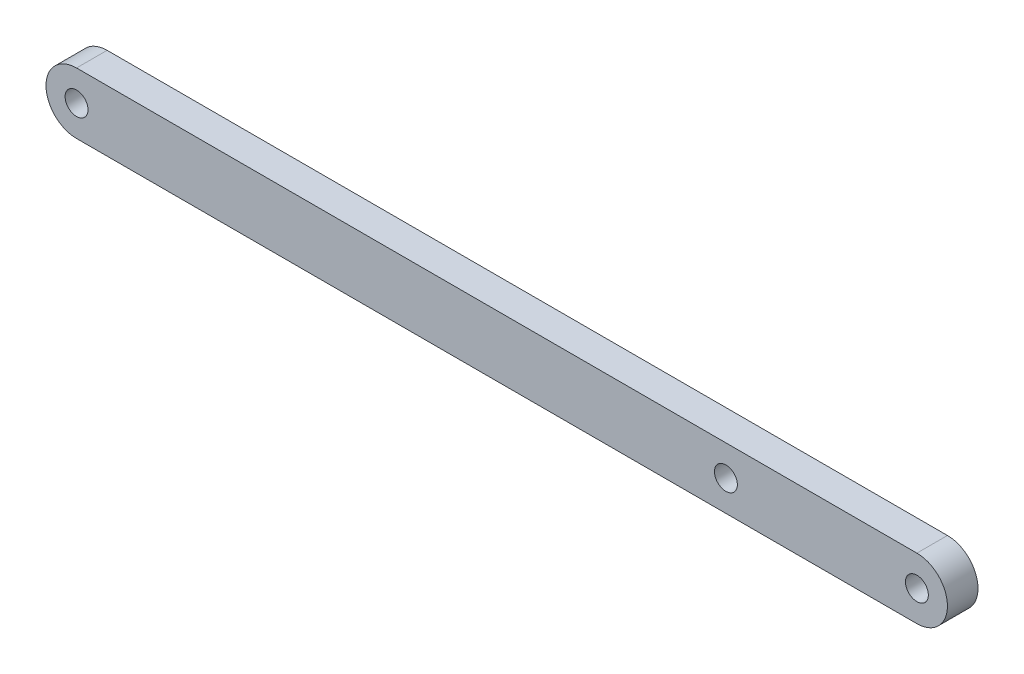
ISO-10303-21;
HEADER;
FILE_DESCRIPTION(('STEP AP214'),'2;1');
FILE_NAME('part.step','',(''),(''),'','','');
FILE_SCHEMA(('AUTOMOTIVE_DESIGN { 1 0 10303 214 1 1 1 1 }'));
ENDSEC;
DATA;
#1=APPLICATION_CONTEXT('core data for automotive mechanical design processes');
#2=APPLICATION_PROTOCOL_DEFINITION('international standard','automotive_design',2000,#1);
#3=PRODUCT_CONTEXT('',#1,'mechanical');
#4=PRODUCT('Part','Part','',(#3));
#5=PRODUCT_RELATED_PRODUCT_CATEGORY('part','',(#4));
#6=PRODUCT_DEFINITION_FORMATION('','',#4);
#7=PRODUCT_DEFINITION_CONTEXT('part definition',#1,'design');
#8=PRODUCT_DEFINITION('design','',#6,#7);
#9=PRODUCT_DEFINITION_SHAPE('','',#8);
#10=(LENGTH_UNIT() NAMED_UNIT(*) SI_UNIT(.MILLI.,.METRE.));
#11=(NAMED_UNIT(*) PLANE_ANGLE_UNIT() SI_UNIT($,.RADIAN.));
#12=(NAMED_UNIT(*) SI_UNIT($,.STERADIAN.) SOLID_ANGLE_UNIT());
#13=UNCERTAINTY_MEASURE_WITH_UNIT(LENGTH_MEASURE(1.E-05),#10,'distance_accuracy_value','');
#14=(GEOMETRIC_REPRESENTATION_CONTEXT(3) GLOBAL_UNCERTAINTY_ASSIGNED_CONTEXT((#13)) GLOBAL_UNIT_ASSIGNED_CONTEXT((#10,
#11,#12)) REPRESENTATION_CONTEXT('',''));
#15=CARTESIAN_POINT('',(0.,0.,0.));
#16=DIRECTION('',(0.,0.,1.));
#17=DIRECTION('',(1.,0.,0.));
#18=AXIS2_PLACEMENT_3D('',#15,#16,#17);
#19=CARTESIAN_POINT('',(55.,0.,4.));
#20=DIRECTION('',(0.,0.,1.));
#21=DIRECTION('',(1.,0.,0.));
#22=AXIS2_PLACEMENT_3D('',#19,#20,#21);
#23=PLANE('',#22);
#24=CARTESIAN_POINT('',(30.,0.,4.));
#25=DIRECTION('',(0.,0.,1.));
#26=DIRECTION('',(1.,0.,0.));
#27=AXIS2_PLACEMENT_3D('',#24,#25,#26);
#28=CIRCLE('',#27,1.5);
#29=CARTESIAN_POINT('',(31.5,0.,4.));
#30=VERTEX_POINT('',#29);
#31=EDGE_CURVE('E131',#30,#30,#28,.T.);
#32=ORIENTED_EDGE('',*,*,#31,.F.);
#33=EDGE_LOOP('',(#32));
#34=FACE_BOUND('',#33,.T.);
#35=CARTESIAN_POINT('',(-55.,0.,4.));
#36=DIRECTION('',(0.,0.,1.));
#37=DIRECTION('',(1.,0.,0.));
#38=AXIS2_PLACEMENT_3D('',#35,#36,#37);
#39=CIRCLE('',#38,1.5);
#40=CARTESIAN_POINT('',(-53.5,0.,4.));
#41=VERTEX_POINT('',#40);
#42=EDGE_CURVE('E108',#41,#41,#39,.T.);
#43=ORIENTED_EDGE('',*,*,#42,.F.);
#44=EDGE_LOOP('',(#43));
#45=FACE_BOUND('',#44,.T.);
#46=CARTESIAN_POINT('',(55.,0.,4.));
#47=DIRECTION('',(0.,0.,1.));
#48=DIRECTION('',(1.,0.,0.));
#49=AXIS2_PLACEMENT_3D('',#46,#47,#48);
#50=CIRCLE('',#49,4.);
#51=CARTESIAN_POINT('',(55.,-4.,4.));
#52=VERTEX_POINT('',#51);
#53=CARTESIAN_POINT('',(55.,4.,4.));
#54=VERTEX_POINT('',#53);
#55=EDGE_CURVE('E92',#52,#54,#50,.T.);
#56=ORIENTED_EDGE('',*,*,#55,.T.);
#57=DIRECTION('',(-1.,0.,0.));
#58=VECTOR('',#57,1.);
#59=CARTESIAN_POINT('',(55.,4.,4.));
#60=LINE('',#59,#58);
#61=CARTESIAN_POINT('',(-55.,3.99999999999999,4.));
#62=VERTEX_POINT('',#61);
#63=EDGE_CURVE('E87',#54,#62,#60,.T.);
#64=ORIENTED_EDGE('',*,*,#63,.T.);
#65=CARTESIAN_POINT('',(-55.,0.,4.));
#66=DIRECTION('',(0.,0.,1.));
#67=DIRECTION('',(1.,0.,0.));
#68=AXIS2_PLACEMENT_3D('',#65,#66,#67);
#69=CIRCLE('',#68,4.);
#70=CARTESIAN_POINT('',(-55.,-4.00000000000002,4.));
#71=VERTEX_POINT('',#70);
#72=EDGE_CURVE('E90',#62,#71,#69,.T.);
#73=ORIENTED_EDGE('',*,*,#72,.T.);
#74=DIRECTION('',(1.,0.,0.));
#75=VECTOR('',#74,1.);
#76=CARTESIAN_POINT('',(55.,-4.,4.));
#77=LINE('',#76,#75);
#78=EDGE_CURVE('E57',#71,#52,#77,.T.);
#79=ORIENTED_EDGE('',*,*,#78,.T.);
#80=EDGE_LOOP('',(#56,#64,#73,#79));
#81=FACE_BOUND('',#80,.T.);
#82=CARTESIAN_POINT('',(55.,0.,4.));
#83=DIRECTION('',(0.,0.,1.));
#84=DIRECTION('',(1.,0.,0.));
#85=AXIS2_PLACEMENT_3D('',#82,#83,#84);
#86=CIRCLE('',#85,1.5);
#87=CARTESIAN_POINT('',(56.5,0.,4.));
#88=VERTEX_POINT('',#87);
#89=EDGE_CURVE('E123',#88,#88,#86,.T.);
#90=ORIENTED_EDGE('',*,*,#89,.F.);
#91=EDGE_LOOP('',(#90));
#92=FACE_BOUND('',#91,.T.);
#93=ADVANCED_FACE('F39',(#34,#45,#81,#92),#23,.T.);
#94=CARTESIAN_POINT('',(55.,0.,0.));
#95=DIRECTION('',(0.,0.,1.));
#96=DIRECTION('',(1.,0.,0.));
#97=AXIS2_PLACEMENT_3D('',#94,#95,#96);
#98=PLANE('',#97);
#99=CARTESIAN_POINT('',(30.,0.,0.));
#100=DIRECTION('',(0.,0.,1.));
#101=DIRECTION('',(1.,0.,0.));
#102=AXIS2_PLACEMENT_3D('',#99,#100,#101);
#103=CIRCLE('',#102,1.5);
#104=CARTESIAN_POINT('',(31.5,0.,0.));
#105=VERTEX_POINT('',#104);
#106=EDGE_CURVE('E43',#105,#105,#103,.T.);
#107=ORIENTED_EDGE('',*,*,#106,.T.);
#108=EDGE_LOOP('',(#107));
#109=FACE_BOUND('',#108,.T.);
#110=CARTESIAN_POINT('',(55.,0.,0.));
#111=DIRECTION('',(0.,0.,1.));
#112=DIRECTION('',(1.,0.,0.));
#113=AXIS2_PLACEMENT_3D('',#110,#111,#112);
#114=CIRCLE('',#113,4.);
#115=CARTESIAN_POINT('',(55.,-4.,0.));
#116=VERTEX_POINT('',#115);
#117=CARTESIAN_POINT('',(55.,4.,0.));
#118=VERTEX_POINT('',#117);
#119=EDGE_CURVE('E105',#116,#118,#114,.T.);
#120=ORIENTED_EDGE('',*,*,#119,.F.);
#121=DIRECTION('',(1.,0.,0.));
#122=VECTOR('',#121,1.);
#123=CARTESIAN_POINT('',(55.,-4.,0.));
#124=LINE('',#123,#122);
#125=CARTESIAN_POINT('',(-55.,-4.00000000000002,0.));
#126=VERTEX_POINT('',#125);
#127=EDGE_CURVE('E80',#126,#116,#124,.T.);
#128=ORIENTED_EDGE('',*,*,#127,.F.);
#129=CARTESIAN_POINT('',(-55.,0.,0.));
#130=DIRECTION('',(0.,0.,1.));
#131=DIRECTION('',(1.,0.,0.));
#132=AXIS2_PLACEMENT_3D('',#129,#130,#131);
#133=CIRCLE('',#132,4.);
#134=CARTESIAN_POINT('',(-55.,3.99999999999999,0.));
#135=VERTEX_POINT('',#134);
#136=EDGE_CURVE('E74',#135,#126,#133,.T.);
#137=ORIENTED_EDGE('',*,*,#136,.F.);
#138=DIRECTION('',(-1.,0.,0.));
#139=VECTOR('',#138,1.);
#140=CARTESIAN_POINT('',(55.,4.,0.));
#141=LINE('',#140,#139);
#142=EDGE_CURVE('E96',#118,#135,#141,.T.);
#143=ORIENTED_EDGE('',*,*,#142,.F.);
#144=EDGE_LOOP('',(#120,#128,#137,#143));
#145=FACE_BOUND('',#144,.T.);
#146=CARTESIAN_POINT('',(-55.,0.,0.));
#147=DIRECTION('',(0.,0.,1.));
#148=DIRECTION('',(1.,0.,0.));
#149=AXIS2_PLACEMENT_3D('',#146,#147,#148);
#150=CIRCLE('',#149,1.5);
#151=CARTESIAN_POINT('',(-53.5,0.,0.));
#152=VERTEX_POINT('',#151);
#153=EDGE_CURVE('E120',#152,#152,#150,.T.);
#154=ORIENTED_EDGE('',*,*,#153,.T.);
#155=EDGE_LOOP('',(#154));
#156=FACE_BOUND('',#155,.T.);
#157=CARTESIAN_POINT('',(55.,0.,0.));
#158=DIRECTION('',(0.,0.,1.));
#159=DIRECTION('',(1.,0.,0.));
#160=AXIS2_PLACEMENT_3D('',#157,#158,#159);
#161=CIRCLE('',#160,1.5);
#162=CARTESIAN_POINT('',(56.5,0.,0.));
#163=VERTEX_POINT('',#162);
#164=EDGE_CURVE('E126',#163,#163,#161,.T.);
#165=ORIENTED_EDGE('',*,*,#164,.T.);
#166=EDGE_LOOP('',(#165));
#167=FACE_BOUND('',#166,.T.);
#168=ADVANCED_FACE('F116',(#109,#145,#156,#167),#98,.F.);
#169=CARTESIAN_POINT('',(55.,0.,4.));
#170=DIRECTION('',(0.,0.,-1.));
#171=DIRECTION('',(-1.,0.,0.));
#172=AXIS2_PLACEMENT_3D('',#169,#170,#171);
#173=CYLINDRICAL_SURFACE('',#172,4.);
#174=ORIENTED_EDGE('',*,*,#119,.T.);
#175=DIRECTION('',(0.,0.,-1.));
#176=VECTOR('',#175,1.);
#177=CARTESIAN_POINT('',(55.,4.,4.));
#178=LINE('',#177,#176);
#179=EDGE_CURVE('E11',#54,#118,#178,.T.);
#180=ORIENTED_EDGE('',*,*,#179,.F.);
#181=ORIENTED_EDGE('',*,*,#55,.F.);
#182=DIRECTION('',(0.,0.,-1.));
#183=VECTOR('',#182,1.);
#184=CARTESIAN_POINT('',(55.,-4.,4.));
#185=LINE('',#184,#183);
#186=EDGE_CURVE('E101',#52,#116,#185,.T.);
#187=ORIENTED_EDGE('',*,*,#186,.T.);
#188=EDGE_LOOP('',(#174,#180,#181,#187));
#189=FACE_BOUND('',#188,.T.);
#190=ADVANCED_FACE('F41',(#189),#173,.T.);
#191=CARTESIAN_POINT('',(55.,4.,4.));
#192=DIRECTION('',(0.,-1.,0.));
#193=DIRECTION('',(1.,0.,0.));
#194=AXIS2_PLACEMENT_3D('',#191,#192,#193);
#195=PLANE('',#194);
#196=ORIENTED_EDGE('',*,*,#142,.T.);
#197=DIRECTION('',(0.,0.,-1.));
#198=VECTOR('',#197,1.);
#199=CARTESIAN_POINT('',(-55.,3.99999999999999,4.));
#200=LINE('',#199,#198);
#201=EDGE_CURVE('E49',#62,#135,#200,.T.);
#202=ORIENTED_EDGE('',*,*,#201,.F.);
#203=ORIENTED_EDGE('',*,*,#63,.F.);
#204=ORIENTED_EDGE('',*,*,#179,.T.);
#205=EDGE_LOOP('',(#196,#202,#203,#204));
#206=FACE_BOUND('',#205,.T.);
#207=ADVANCED_FACE('F95',(#206),#195,.F.);
#208=CARTESIAN_POINT('',(-55.,0.,4.));
#209=DIRECTION('',(0.,0.,-1.));
#210=DIRECTION('',(-1.,0.,0.));
#211=AXIS2_PLACEMENT_3D('',#208,#209,#210);
#212=CYLINDRICAL_SURFACE('',#211,4.);
#213=ORIENTED_EDGE('',*,*,#136,.T.);
#214=DIRECTION('',(0.,0.,-1.));
#215=VECTOR('',#214,1.);
#216=CARTESIAN_POINT('',(-55.,-4.00000000000002,4.));
#217=LINE('',#216,#215);
#218=EDGE_CURVE('E97',#71,#126,#217,.T.);
#219=ORIENTED_EDGE('',*,*,#218,.F.);
#220=ORIENTED_EDGE('',*,*,#72,.F.);
#221=ORIENTED_EDGE('',*,*,#201,.T.);
#222=EDGE_LOOP('',(#213,#219,#220,#221));
#223=FACE_BOUND('',#222,.T.);
#224=ADVANCED_FACE('F99',(#223),#212,.T.);
#225=CARTESIAN_POINT('',(55.,-4.,4.));
#226=DIRECTION('',(0.,1.,0.));
#227=DIRECTION('',(-1.,0.,0.));
#228=AXIS2_PLACEMENT_3D('',#225,#226,#227);
#229=PLANE('',#228);
#230=ORIENTED_EDGE('',*,*,#127,.T.);
#231=ORIENTED_EDGE('',*,*,#186,.F.);
#232=ORIENTED_EDGE('',*,*,#78,.F.);
#233=ORIENTED_EDGE('',*,*,#218,.T.);
#234=EDGE_LOOP('',(#230,#231,#232,#233));
#235=FACE_BOUND('',#234,.T.);
#236=ADVANCED_FACE('F113',(#235),#229,.F.);
#237=CARTESIAN_POINT('',(-55.,0.,4.));
#238=DIRECTION('',(0.,0.,-1.));
#239=DIRECTION('',(-1.,0.,0.));
#240=AXIS2_PLACEMENT_3D('',#237,#238,#239);
#241=CYLINDRICAL_SURFACE('',#240,1.5);
#242=ORIENTED_EDGE('',*,*,#42,.T.);
#243=EDGE_LOOP('',(#242));
#244=FACE_BOUND('',#243,.T.);
#245=ORIENTED_EDGE('',*,*,#153,.F.);
#246=EDGE_LOOP('',(#245));
#247=FACE_BOUND('',#246,.T.);
#248=ADVANCED_FACE('F146',(#244,#247),#241,.F.);
#249=CARTESIAN_POINT('',(55.,0.,4.));
#250=DIRECTION('',(0.,0.,-1.));
#251=DIRECTION('',(-1.,0.,0.));
#252=AXIS2_PLACEMENT_3D('',#249,#250,#251);
#253=CYLINDRICAL_SURFACE('',#252,1.5);
#254=ORIENTED_EDGE('',*,*,#89,.T.);
#255=EDGE_LOOP('',(#254));
#256=FACE_BOUND('',#255,.T.);
#257=ORIENTED_EDGE('',*,*,#164,.F.);
#258=EDGE_LOOP('',(#257));
#259=FACE_BOUND('',#258,.T.);
#260=ADVANCED_FACE('F141',(#256,#259),#253,.F.);
#261=CARTESIAN_POINT('',(30.,0.,-6.));
#262=DIRECTION('',(0.,0.,1.));
#263=DIRECTION('',(1.,0.,0.));
#264=AXIS2_PLACEMENT_3D('',#261,#262,#263);
#265=CYLINDRICAL_SURFACE('',#264,1.5);
#266=ORIENTED_EDGE('',*,*,#31,.T.);
#267=EDGE_LOOP('',(#266));
#268=FACE_BOUND('',#267,.T.);
#269=ORIENTED_EDGE('',*,*,#106,.F.);
#270=EDGE_LOOP('',(#269));
#271=FACE_BOUND('',#270,.T.);
#272=ADVANCED_FACE('F139',(#268,#271),#265,.F.);
#273=CLOSED_SHELL('',(#93,#168,#190,#207,#224,#236,#248,#260,#272));
#274=MANIFOLD_SOLID_BREP('B2',#273);
#275=ADVANCED_BREP_SHAPE_REPRESENTATION('',(#18,#274),#14);
#276=SHAPE_DEFINITION_REPRESENTATION(#9,#275);
ENDSEC;
END-ISO-10303-21;
